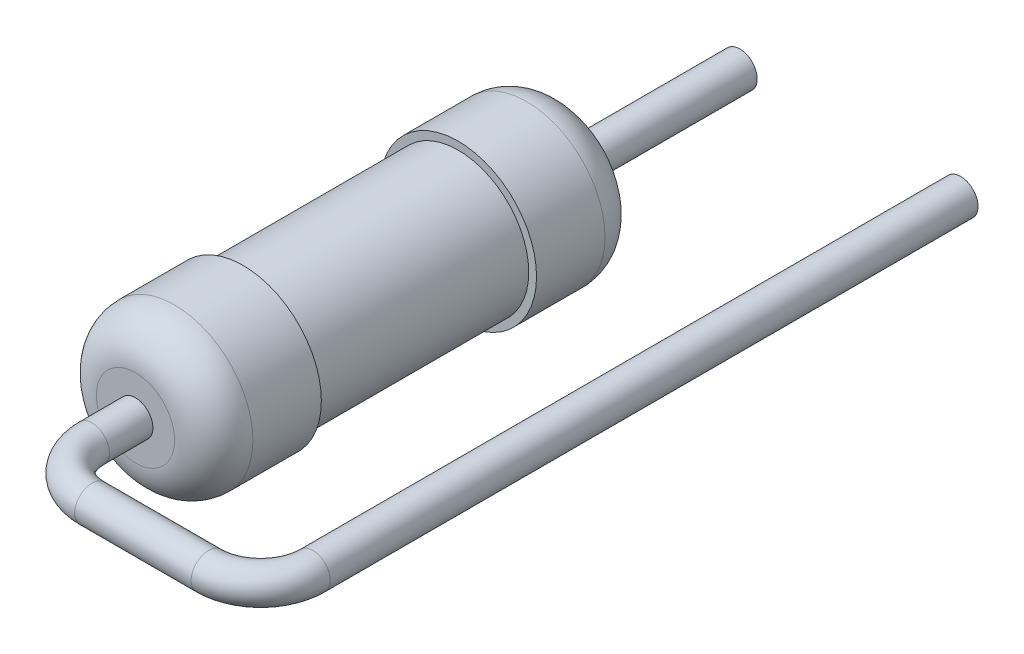
ISO-10303-21;
HEADER;
FILE_DESCRIPTION(('STEP AP214'),'2;1');
FILE_NAME('part.step','',(''),(''),'','','');
FILE_SCHEMA(('AUTOMOTIVE_DESIGN { 1 0 10303 214 1 1 1 1 }'));
ENDSEC;
DATA;
#1=APPLICATION_CONTEXT('core data for automotive mechanical design processes');
#2=APPLICATION_PROTOCOL_DEFINITION('international standard','automotive_design',2000,#1);
#3=PRODUCT_CONTEXT('',#1,'mechanical');
#4=PRODUCT('Part','Part','',(#3));
#5=PRODUCT_RELATED_PRODUCT_CATEGORY('part','',(#4));
#6=PRODUCT_DEFINITION_FORMATION('','',#4);
#7=PRODUCT_DEFINITION_CONTEXT('part definition',#1,'design');
#8=PRODUCT_DEFINITION('design','',#6,#7);
#9=PRODUCT_DEFINITION_SHAPE('','',#8);
#10=(LENGTH_UNIT() NAMED_UNIT(*) SI_UNIT(.MILLI.,.METRE.));
#11=(NAMED_UNIT(*) PLANE_ANGLE_UNIT() SI_UNIT($,.RADIAN.));
#12=(NAMED_UNIT(*) SI_UNIT($,.STERADIAN.) SOLID_ANGLE_UNIT());
#13=UNCERTAINTY_MEASURE_WITH_UNIT(LENGTH_MEASURE(1.E-05),#10,'distance_accuracy_value','');
#14=(GEOMETRIC_REPRESENTATION_CONTEXT(3) GLOBAL_UNCERTAINTY_ASSIGNED_CONTEXT((#13)) GLOBAL_UNIT_ASSIGNED_CONTEXT((#10,
#11,#12)) REPRESENTATION_CONTEXT('',''));
#15=CARTESIAN_POINT('',(0.,0.,0.));
#16=DIRECTION('',(0.,0.,1.));
#17=DIRECTION('',(1.,0.,0.));
#18=AXIS2_PLACEMENT_3D('',#15,#16,#17);
#19=CARTESIAN_POINT('',(4.68,0.,-3.));
#20=DIRECTION('',(0.,0.,1.));
#21=DIRECTION('',(1.,0.,0.));
#22=AXIS2_PLACEMENT_3D('',#19,#20,#21);
#23=PLANE('',#22);
#24=CARTESIAN_POINT('',(5.08,0.,-3.));
#25=DIRECTION('',(0.,0.,-1.));
#26=DIRECTION('',(-1.,0.,0.));
#27=AXIS2_PLACEMENT_3D('',#24,#25,#26);
#28=CIRCLE('',#27,0.4);
#29=CARTESIAN_POINT('',(4.68,0.,-3.));
#30=VERTEX_POINT('',#29);
#31=EDGE_CURVE('E10',#30,#30,#28,.T.);
#32=ORIENTED_EDGE('',*,*,#31,.T.);
#33=EDGE_LOOP('',(#32));
#34=FACE_BOUND('',#33,.T.);
#35=ADVANCED_FACE('F15',(#34),#23,.F.);
#36=CARTESIAN_POINT('',(5.08,0.,11.9));
#37=DIRECTION('',(0.,0.,-1.));
#38=DIRECTION('',(-1.,0.,0.));
#39=AXIS2_PLACEMENT_3D('',#36,#37,#38);
#40=CYLINDRICAL_SURFACE('',#39,0.4);
#41=ORIENTED_EDGE('',*,*,#31,.F.);
#42=EDGE_LOOP('',(#41));
#43=FACE_BOUND('',#42,.T.);
#44=CARTESIAN_POINT('',(5.08,0.,11.9));
#45=DIRECTION('',(0.,0.,1.));
#46=DIRECTION('',(1.,0.,0.));
#47=AXIS2_PLACEMENT_3D('',#44,#45,#46);
#48=CIRCLE('',#47,0.4);
#49=CARTESIAN_POINT('',(5.48,0.,11.9));
#50=VERTEX_POINT('',#49);
#51=EDGE_CURVE('E22',#50,#50,#48,.T.);
#52=ORIENTED_EDGE('',*,*,#51,.F.);
#53=EDGE_LOOP('',(#52));
#54=FACE_BOUND('',#53,.T.);
#55=ADVANCED_FACE('F110',(#43,#54),#40,.T.);
#56=CARTESIAN_POINT('',(3.88,0.,11.9));
#57=DIRECTION('',(0.,1.,0.));
#58=DIRECTION('',(0.,0.,1.));
#59=AXIS2_PLACEMENT_3D('',#56,#57,#58);
#60=TOROIDAL_SURFACE('',#59,1.2,0.4);
#61=CARTESIAN_POINT('',(3.88,0.,13.1));
#62=DIRECTION('',(1.,0.,0.));
#63=DIRECTION('',(0.,0.,-1.));
#64=AXIS2_PLACEMENT_3D('',#61,#62,#63);
#65=CIRCLE('',#64,0.4);
#66=CARTESIAN_POINT('',(3.88,0.,13.5));
#67=VERTEX_POINT('',#66);
#68=EDGE_CURVE('E30',#67,#67,#65,.T.);
#69=CARTESIAN_POINT('',(3.88,0.,11.9));
#70=DIRECTION('',(0.,1.,0.));
#71=DIRECTION('',(0.,0.,1.));
#72=AXIS2_PLACEMENT_3D('',#69,#70,#71);
#73=CIRCLE('',#72,1.6);
#74=EDGE_CURVE('',#67,#50,#73,.T.);
#75=ORIENTED_EDGE('',*,*,#68,.T.);
#76=ORIENTED_EDGE('',*,*,#51,.T.);
#77=ORIENTED_EDGE('',*,*,#74,.T.);
#78=ORIENTED_EDGE('',*,*,#74,.F.);
#79=EDGE_LOOP('',(#75,#77,#76,#78));
#80=FACE_BOUND('',#79,.T.);
#81=ADVANCED_FACE('F115',(#80),#60,.T.);
#82=CARTESIAN_POINT('',(1.2,0.,13.1));
#83=DIRECTION('',(1.,0.,0.));
#84=DIRECTION('',(0.,0.,-1.));
#85=AXIS2_PLACEMENT_3D('',#82,#83,#84);
#86=CYLINDRICAL_SURFACE('',#85,0.4);
#87=ORIENTED_EDGE('',*,*,#68,.F.);
#88=EDGE_LOOP('',(#87));
#89=FACE_BOUND('',#88,.T.);
#90=CARTESIAN_POINT('',(1.2,0.,13.1));
#91=DIRECTION('',(-1.,0.,0.));
#92=DIRECTION('',(0.,0.,1.));
#93=AXIS2_PLACEMENT_3D('',#90,#91,#92);
#94=CIRCLE('',#93,0.4);
#95=CARTESIAN_POINT('',(1.2,0.,13.5));
#96=VERTEX_POINT('',#95);
#97=EDGE_CURVE('E37',#96,#96,#94,.T.);
#98=ORIENTED_EDGE('',*,*,#97,.F.);
#99=EDGE_LOOP('',(#98));
#100=FACE_BOUND('',#99,.T.);
#101=ADVANCED_FACE('F121',(#89,#100),#86,.T.);
#102=CARTESIAN_POINT('',(1.2,0.,11.9));
#103=DIRECTION('',(0.,1.,0.));
#104=DIRECTION('',(-1.,0.,0.));
#105=AXIS2_PLACEMENT_3D('',#102,#103,#104);
#106=TOROIDAL_SURFACE('',#105,1.2,0.4);
#107=CARTESIAN_POINT('',(0.,0.,11.9));
#108=DIRECTION('',(0.,0.,1.));
#109=DIRECTION('',(1.,0.,0.));
#110=AXIS2_PLACEMENT_3D('',#107,#108,#109);
#111=CIRCLE('',#110,0.4);
#112=CARTESIAN_POINT('',(-0.4,0.,11.9));
#113=VERTEX_POINT('',#112);
#114=EDGE_CURVE('E42',#113,#113,#111,.T.);
#115=CARTESIAN_POINT('',(1.2,0.,11.9));
#116=DIRECTION('',(0.,1.,0.));
#117=DIRECTION('',(-1.,0.,0.));
#118=AXIS2_PLACEMENT_3D('',#115,#116,#117);
#119=CIRCLE('',#118,1.6);
#120=EDGE_CURVE('',#113,#96,#119,.T.);
#121=ORIENTED_EDGE('',*,*,#114,.T.);
#122=ORIENTED_EDGE('',*,*,#97,.T.);
#123=ORIENTED_EDGE('',*,*,#120,.T.);
#124=ORIENTED_EDGE('',*,*,#120,.F.);
#125=EDGE_LOOP('',(#121,#123,#122,#124));
#126=FACE_BOUND('',#125,.T.);
#127=ADVANCED_FACE('F128',(#126),#106,.T.);
#128=CARTESIAN_POINT('',(0.,0.,-3.));
#129=DIRECTION('',(0.,0.,1.));
#130=DIRECTION('',(1.,0.,0.));
#131=AXIS2_PLACEMENT_3D('',#128,#129,#130);
#132=CYLINDRICAL_SURFACE('',#131,0.4);
#133=ORIENTED_EDGE('',*,*,#114,.F.);
#134=EDGE_LOOP('',(#133));
#135=FACE_BOUND('',#134,.T.);
#136=CARTESIAN_POINT('',(0.,0.,10.9));
#137=DIRECTION('',(0.,0.,1.));
#138=DIRECTION('',(1.,0.,0.));
#139=AXIS2_PLACEMENT_3D('',#136,#137,#138);
#140=CIRCLE('',#139,0.4);
#141=CARTESIAN_POINT('',(0.4,0.,10.9));
#142=VERTEX_POINT('',#141);
#143=EDGE_CURVE('E45',#142,#142,#140,.T.);
#144=ORIENTED_EDGE('',*,*,#143,.T.);
#145=EDGE_LOOP('',(#144));
#146=FACE_BOUND('',#145,.T.);
#147=ADVANCED_FACE('F131',(#135,#146),#132,.T.);
#148=CARTESIAN_POINT('',(1.8,0.,10.9));
#149=DIRECTION('',(0.,0.,-1.));
#150=DIRECTION('',(0.,-1.,0.));
#151=AXIS2_PLACEMENT_3D('',#148,#149,#150);
#152=PLANE('',#151);
#153=ORIENTED_EDGE('',*,*,#143,.F.);
#154=EDGE_LOOP('',(#153));
#155=FACE_BOUND('',#154,.T.);
#156=CARTESIAN_POINT('',(0.,0.,10.9));
#157=DIRECTION('',(0.,0.,1.));
#158=DIRECTION('',(1.,0.,0.));
#159=AXIS2_PLACEMENT_3D('',#156,#157,#158);
#160=CIRCLE('',#159,0.9);
#161=CARTESIAN_POINT('',(0.9,0.,10.9));
#162=VERTEX_POINT('',#161);
#163=EDGE_CURVE('E50',#162,#162,#160,.T.);
#164=ORIENTED_EDGE('',*,*,#163,.T.);
#165=EDGE_LOOP('',(#164));
#166=FACE_BOUND('',#165,.T.);
#167=ADVANCED_FACE('F134',(#155,#166),#152,.F.);
#168=CARTESIAN_POINT('',(0.,0.,10.));
#169=DIRECTION('',(0.,0.,1.));
#170=DIRECTION('',(1.,0.,0.));
#171=AXIS2_PLACEMENT_3D('',#168,#169,#170);
#172=DEGENERATE_TOROIDAL_SURFACE('',#171,0.9,0.9,.T.);
#173=ORIENTED_EDGE('',*,*,#163,.F.);
#174=EDGE_LOOP('',(#173));
#175=FACE_BOUND('',#174,.T.);
#176=CARTESIAN_POINT('',(0.,0.,10.));
#177=DIRECTION('',(0.,0.,1.));
#178=DIRECTION('',(1.,0.,0.));
#179=AXIS2_PLACEMENT_3D('',#176,#177,#178);
#180=CIRCLE('',#179,1.8);
#181=CARTESIAN_POINT('',(1.8,0.,10.));
#182=VERTEX_POINT('',#181);
#183=EDGE_CURVE('E60',#182,#182,#180,.T.);
#184=ORIENTED_EDGE('',*,*,#183,.T.);
#185=EDGE_LOOP('',(#184));
#186=FACE_BOUND('',#185,.T.);
#187=ADVANCED_FACE('F126',(#175,#186),#172,.T.);
#188=CARTESIAN_POINT('',(0.,0.,8.425));
#189=DIRECTION('',(0.,0.,-1.));
#190=DIRECTION('',(1.,0.,0.));
#191=AXIS2_PLACEMENT_3D('',#188,#189,#190);
#192=CYLINDRICAL_SURFACE('',#191,1.8);
#193=ORIENTED_EDGE('',*,*,#183,.F.);
#194=EDGE_LOOP('',(#193));
#195=FACE_BOUND('',#194,.T.);
#196=CARTESIAN_POINT('',(0.,0.,8.425));
#197=DIRECTION('',(0.,0.,1.));
#198=DIRECTION('',(1.,0.,0.));
#199=AXIS2_PLACEMENT_3D('',#196,#197,#198);
#200=CIRCLE('',#199,1.8);
#201=CARTESIAN_POINT('',(1.8,0.,8.425));
#202=VERTEX_POINT('',#201);
#203=EDGE_CURVE('E55',#202,#202,#200,.T.);
#204=ORIENTED_EDGE('',*,*,#203,.T.);
#205=EDGE_LOOP('',(#204));
#206=FACE_BOUND('',#205,.T.);
#207=ADVANCED_FACE('F154',(#195,#206),#192,.T.);
#208=CARTESIAN_POINT('',(0.4,0.,-3.));
#209=DIRECTION('',(0.,0.,-1.));
#210=DIRECTION('',(0.,-1.,0.));
#211=AXIS2_PLACEMENT_3D('',#208,#209,#210);
#212=PLANE('',#211);
#213=CARTESIAN_POINT('',(0.,0.,-3.));
#214=DIRECTION('',(0.,0.,1.));
#215=DIRECTION('',(1.,0.,0.));
#216=AXIS2_PLACEMENT_3D('',#213,#214,#215);
#217=CIRCLE('',#216,0.4);
#218=CARTESIAN_POINT('',(0.4,0.,-3.));
#219=VERTEX_POINT('',#218);
#220=EDGE_CURVE('E51',#219,#219,#217,.T.);
#221=ORIENTED_EDGE('',*,*,#220,.F.);
#222=EDGE_LOOP('',(#221));
#223=FACE_BOUND('',#222,.T.);
#224=ADVANCED_FACE('F159',(#223),#212,.T.);
#225=CARTESIAN_POINT('',(1.8,0.,8.425));
#226=DIRECTION('',(0.,0.,-1.));
#227=DIRECTION('',(0.,-1.,0.));
#228=AXIS2_PLACEMENT_3D('',#225,#226,#227);
#229=PLANE('',#228);
#230=CARTESIAN_POINT('',(0.,0.,8.425));
#231=DIRECTION('',(0.,0.,-1.));
#232=DIRECTION('',(1.,0.,0.));
#233=AXIS2_PLACEMENT_3D('',#230,#231,#232);
#234=CIRCLE('',#233,1.62);
#235=CARTESIAN_POINT('',(1.62,0.,8.425));
#236=VERTEX_POINT('',#235);
#237=EDGE_CURVE('E56',#236,#236,#234,.T.);
#238=ORIENTED_EDGE('',*,*,#237,.F.);
#239=EDGE_LOOP('',(#238));
#240=FACE_BOUND('',#239,.T.);
#241=ORIENTED_EDGE('',*,*,#203,.F.);
#242=EDGE_LOOP('',(#241));
#243=FACE_BOUND('',#242,.T.);
#244=ADVANCED_FACE('F163',(#240,#243),#229,.T.);
#245=CARTESIAN_POINT('',(0.,0.,-3.));
#246=DIRECTION('',(0.,0.,1.));
#247=DIRECTION('',(1.,0.,0.));
#248=AXIS2_PLACEMENT_3D('',#245,#246,#247);
#249=CYLINDRICAL_SURFACE('',#248,0.4);
#250=CARTESIAN_POINT('',(0.,0.,1.));
#251=DIRECTION('',(0.,0.,1.));
#252=DIRECTION('',(1.,0.,0.));
#253=AXIS2_PLACEMENT_3D('',#250,#251,#252);
#254=CIRCLE('',#253,0.4);
#255=CARTESIAN_POINT('',(0.4,0.,1.));
#256=VERTEX_POINT('',#255);
#257=EDGE_CURVE('E67',#256,#256,#254,.T.);
#258=ORIENTED_EDGE('',*,*,#257,.F.);
#259=EDGE_LOOP('',(#258));
#260=FACE_BOUND('',#259,.T.);
#261=ORIENTED_EDGE('',*,*,#220,.T.);
#262=EDGE_LOOP('',(#261));
#263=FACE_BOUND('',#262,.T.);
#264=ADVANCED_FACE('F165',(#260,#263),#249,.T.);
#265=CARTESIAN_POINT('',(0.,0.,1.));
#266=DIRECTION('',(0.,0.,-1.));
#267=DIRECTION('',(1.,0.,0.));
#268=AXIS2_PLACEMENT_3D('',#265,#266,#267);
#269=CYLINDRICAL_SURFACE('',#268,1.62);
#270=ORIENTED_EDGE('',*,*,#237,.T.);
#271=EDGE_LOOP('',(#270));
#272=FACE_BOUND('',#271,.T.);
#273=CARTESIAN_POINT('',(0.,0.,3.475));
#274=DIRECTION('',(0.,0.,-1.));
#275=DIRECTION('',(1.,0.,0.));
#276=AXIS2_PLACEMENT_3D('',#273,#274,#275);
#277=CIRCLE('',#276,1.62);
#278=CARTESIAN_POINT('',(1.62,0.,3.475));
#279=VERTEX_POINT('',#278);
#280=EDGE_CURVE('E68',#279,#279,#277,.T.);
#281=ORIENTED_EDGE('',*,*,#280,.F.);
#282=EDGE_LOOP('',(#281));
#283=FACE_BOUND('',#282,.T.);
#284=ADVANCED_FACE('F173',(#272,#283),#269,.T.);
#285=CARTESIAN_POINT('',(1.8,0.,1.));
#286=DIRECTION('',(0.,0.,-1.));
#287=DIRECTION('',(0.,-1.,0.));
#288=AXIS2_PLACEMENT_3D('',#285,#286,#287);
#289=PLANE('',#288);
#290=ORIENTED_EDGE('',*,*,#257,.T.);
#291=EDGE_LOOP('',(#290));
#292=FACE_BOUND('',#291,.T.);
#293=CARTESIAN_POINT('',(0.,0.,1.));
#294=DIRECTION('',(0.,0.,1.));
#295=DIRECTION('',(1.,0.,0.));
#296=AXIS2_PLACEMENT_3D('',#293,#294,#295);
#297=CIRCLE('',#296,0.9);
#298=CARTESIAN_POINT('',(0.9,0.,1.));
#299=VERTEX_POINT('',#298);
#300=EDGE_CURVE('E72',#299,#299,#297,.T.);
#301=ORIENTED_EDGE('',*,*,#300,.F.);
#302=EDGE_LOOP('',(#301));
#303=FACE_BOUND('',#302,.T.);
#304=ADVANCED_FACE('F106',(#292,#303),#289,.T.);
#305=CARTESIAN_POINT('',(1.8,0.,3.475));
#306=DIRECTION('',(0.,0.,-1.));
#307=DIRECTION('',(0.,-1.,0.));
#308=AXIS2_PLACEMENT_3D('',#305,#306,#307);
#309=PLANE('',#308);
#310=ORIENTED_EDGE('',*,*,#280,.T.);
#311=EDGE_LOOP('',(#310));
#312=FACE_BOUND('',#311,.T.);
#313=CARTESIAN_POINT('',(0.,0.,3.475));
#314=DIRECTION('',(0.,0.,1.));
#315=DIRECTION('',(1.,0.,0.));
#316=AXIS2_PLACEMENT_3D('',#313,#314,#315);
#317=CIRCLE('',#316,1.8);
#318=CARTESIAN_POINT('',(1.8,0.,3.475));
#319=VERTEX_POINT('',#318);
#320=EDGE_CURVE('E79',#319,#319,#317,.T.);
#321=ORIENTED_EDGE('',*,*,#320,.T.);
#322=EDGE_LOOP('',(#321));
#323=FACE_BOUND('',#322,.T.);
#324=ADVANCED_FACE('F96',(#312,#323),#309,.F.);
#325=CARTESIAN_POINT('',(0.,0.,1.9));
#326=DIRECTION('',(0.,0.,-1.));
#327=DIRECTION('',(1.,0.,0.));
#328=AXIS2_PLACEMENT_3D('',#325,#326,#327);
#329=DEGENERATE_TOROIDAL_SURFACE('',#328,0.9,0.9,.T.);
#330=ORIENTED_EDGE('',*,*,#300,.T.);
#331=EDGE_LOOP('',(#330));
#332=FACE_BOUND('',#331,.T.);
#333=CARTESIAN_POINT('',(0.,0.,1.9));
#334=DIRECTION('',(0.,0.,1.));
#335=DIRECTION('',(1.,0.,0.));
#336=AXIS2_PLACEMENT_3D('',#333,#334,#335);
#337=CIRCLE('',#336,1.8);
#338=CARTESIAN_POINT('',(1.8,0.,1.9));
#339=VERTEX_POINT('',#338);
#340=EDGE_CURVE('E83',#339,#339,#337,.T.);
#341=ORIENTED_EDGE('',*,*,#340,.F.);
#342=EDGE_LOOP('',(#341));
#343=FACE_BOUND('',#342,.T.);
#344=ADVANCED_FACE('F94',(#332,#343),#329,.T.);
#345=CARTESIAN_POINT('',(0.,0.,1.));
#346=DIRECTION('',(0.,0.,-1.));
#347=DIRECTION('',(1.,0.,0.));
#348=AXIS2_PLACEMENT_3D('',#345,#346,#347);
#349=CYLINDRICAL_SURFACE('',#348,1.8);
#350=ORIENTED_EDGE('',*,*,#320,.F.);
#351=EDGE_LOOP('',(#350));
#352=FACE_BOUND('',#351,.T.);
#353=ORIENTED_EDGE('',*,*,#340,.T.);
#354=EDGE_LOOP('',(#353));
#355=FACE_BOUND('',#354,.T.);
#356=ADVANCED_FACE('F92',(#352,#355),#349,.T.);
#357=CLOSED_SHELL('',(#35,#55,#81,#101,#127,#147,#167,#187,#207,#224,#244,#264,#284,#304,#324,
#344,#356));
#358=MANIFOLD_SOLID_BREP('B1',#357);
#359=ADVANCED_BREP_SHAPE_REPRESENTATION('',(#18,#358),#14);
#360=SHAPE_DEFINITION_REPRESENTATION(#9,#359);
ENDSEC;
END-ISO-10303-21;
